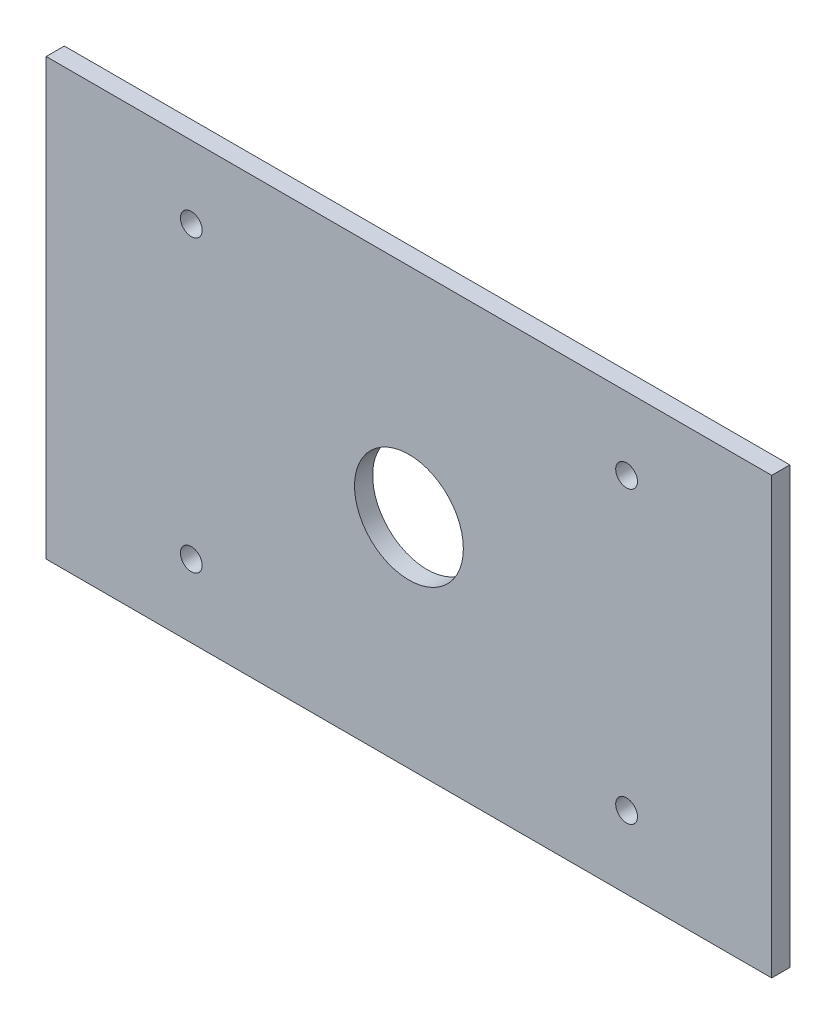
ISO-10303-21;
HEADER;
FILE_DESCRIPTION(('STEP AP214'),'2;1');
FILE_NAME('part.step','',(''),(''),'','','');
FILE_SCHEMA(('AUTOMOTIVE_DESIGN { 1 0 10303 214 1 1 1 1 }'));
ENDSEC;
DATA;
#1=APPLICATION_CONTEXT('core data for automotive mechanical design processes');
#2=APPLICATION_PROTOCOL_DEFINITION('international standard','automotive_design',2000,#1);
#3=PRODUCT_CONTEXT('',#1,'mechanical');
#4=PRODUCT('Part','Part','',(#3));
#5=PRODUCT_RELATED_PRODUCT_CATEGORY('part','',(#4));
#6=PRODUCT_DEFINITION_FORMATION('','',#4);
#7=PRODUCT_DEFINITION_CONTEXT('part definition',#1,'design');
#8=PRODUCT_DEFINITION('design','',#6,#7);
#9=PRODUCT_DEFINITION_SHAPE('','',#8);
#10=(LENGTH_UNIT() NAMED_UNIT(*) SI_UNIT(.MILLI.,.METRE.));
#11=(NAMED_UNIT(*) PLANE_ANGLE_UNIT() SI_UNIT($,.RADIAN.));
#12=(NAMED_UNIT(*) SI_UNIT($,.STERADIAN.) SOLID_ANGLE_UNIT());
#13=UNCERTAINTY_MEASURE_WITH_UNIT(LENGTH_MEASURE(1.E-05),#10,'distance_accuracy_value','');
#14=(GEOMETRIC_REPRESENTATION_CONTEXT(3) GLOBAL_UNCERTAINTY_ASSIGNED_CONTEXT((#13)) GLOBAL_UNIT_ASSIGNED_CONTEXT((#10,
#11,#12)) REPRESENTATION_CONTEXT('',''));
#15=CARTESIAN_POINT('',(0.,0.,0.));
#16=DIRECTION('',(0.,0.,1.));
#17=DIRECTION('',(1.,0.,0.));
#18=AXIS2_PLACEMENT_3D('',#15,#16,#17);
#19=CARTESIAN_POINT('',(-63.5,-38.1,3.175));
#20=DIRECTION('',(1.,0.,0.));
#21=DIRECTION('',(0.,0.,-1.));
#22=AXIS2_PLACEMENT_3D('',#19,#20,#21);
#23=PLANE('',#22);
#24=DIRECTION('',(0.,-1.,0.));
#25=VECTOR('',#24,1.);
#26=CARTESIAN_POINT('',(-63.5,-38.1,0.));
#27=LINE('',#26,#25);
#28=CARTESIAN_POINT('',(-63.5,38.1,0.));
#29=VERTEX_POINT('',#28);
#30=CARTESIAN_POINT('',(-63.5,-38.1,0.));
#31=VERTEX_POINT('',#30);
#32=EDGE_CURVE('E121',#29,#31,#27,.T.);
#33=ORIENTED_EDGE('',*,*,#32,.T.);
#34=DIRECTION('',(0.,0.,-1.));
#35=VECTOR('',#34,1.);
#36=CARTESIAN_POINT('',(-63.5,-38.1,3.175));
#37=LINE('',#36,#35);
#38=CARTESIAN_POINT('',(-63.5,-38.1,3.175));
#39=VERTEX_POINT('',#38);
#40=EDGE_CURVE('E12',#39,#31,#37,.T.);
#41=ORIENTED_EDGE('',*,*,#40,.F.);
#42=DIRECTION('',(0.,-1.,0.));
#43=VECTOR('',#42,1.);
#44=CARTESIAN_POINT('',(-63.5,-38.1,3.175));
#45=LINE('',#44,#43);
#46=CARTESIAN_POINT('',(-63.5,38.1,3.175));
#47=VERTEX_POINT('',#46);
#48=EDGE_CURVE('E104',#47,#39,#45,.T.);
#49=ORIENTED_EDGE('',*,*,#48,.F.);
#50=DIRECTION('',(0.,0.,-1.));
#51=VECTOR('',#50,1.);
#52=CARTESIAN_POINT('',(-63.5,38.1,3.175));
#53=LINE('',#52,#51);
#54=EDGE_CURVE('E117',#47,#29,#53,.T.);
#55=ORIENTED_EDGE('',*,*,#54,.T.);
#56=EDGE_LOOP('',(#33,#41,#49,#55));
#57=FACE_BOUND('',#56,.T.);
#58=ADVANCED_FACE('F50',(#57),#23,.F.);
#59=CARTESIAN_POINT('',(63.5,-38.1,3.175));
#60=DIRECTION('',(0.,1.,0.));
#61=DIRECTION('',(-1.,0.,0.));
#62=AXIS2_PLACEMENT_3D('',#59,#60,#61);
#63=PLANE('',#62);
#64=DIRECTION('',(1.,0.,0.));
#65=VECTOR('',#64,1.);
#66=CARTESIAN_POINT('',(63.5,-38.1,0.));
#67=LINE('',#66,#65);
#68=CARTESIAN_POINT('',(63.5,-38.1,0.));
#69=VERTEX_POINT('',#68);
#70=EDGE_CURVE('E109',#31,#69,#67,.T.);
#71=ORIENTED_EDGE('',*,*,#70,.T.);
#72=DIRECTION('',(0.,0.,-1.));
#73=VECTOR('',#72,1.);
#74=CARTESIAN_POINT('',(63.5,-38.1,3.175));
#75=LINE('',#74,#73);
#76=CARTESIAN_POINT('',(63.5,-38.1,3.175));
#77=VERTEX_POINT('',#76);
#78=EDGE_CURVE('E60',#77,#69,#75,.T.);
#79=ORIENTED_EDGE('',*,*,#78,.F.);
#80=DIRECTION('',(1.,0.,0.));
#81=VECTOR('',#80,1.);
#82=CARTESIAN_POINT('',(63.5,-38.1,3.175));
#83=LINE('',#82,#81);
#84=EDGE_CURVE('E99',#39,#77,#83,.T.);
#85=ORIENTED_EDGE('',*,*,#84,.F.);
#86=ORIENTED_EDGE('',*,*,#40,.T.);
#87=EDGE_LOOP('',(#71,#79,#85,#86));
#88=FACE_BOUND('',#87,.T.);
#89=ADVANCED_FACE('F108',(#88),#63,.F.);
#90=CARTESIAN_POINT('',(63.5,-38.1,3.175));
#91=DIRECTION('',(-1.,0.,0.));
#92=DIRECTION('',(0.,0.,1.));
#93=AXIS2_PLACEMENT_3D('',#90,#91,#92);
#94=PLANE('',#93);
#95=DIRECTION('',(0.,1.,0.));
#96=VECTOR('',#95,1.);
#97=CARTESIAN_POINT('',(63.5,-38.1,0.));
#98=LINE('',#97,#96);
#99=CARTESIAN_POINT('',(63.5,38.1,0.));
#100=VERTEX_POINT('',#99);
#101=EDGE_CURVE('E86',#69,#100,#98,.T.);
#102=ORIENTED_EDGE('',*,*,#101,.T.);
#103=DIRECTION('',(0.,0.,-1.));
#104=VECTOR('',#103,1.);
#105=CARTESIAN_POINT('',(63.5,38.1,3.175));
#106=LINE('',#105,#104);
#107=CARTESIAN_POINT('',(63.5,38.1,3.175));
#108=VERTEX_POINT('',#107);
#109=EDGE_CURVE('E111',#108,#100,#106,.T.);
#110=ORIENTED_EDGE('',*,*,#109,.F.);
#111=DIRECTION('',(0.,1.,0.));
#112=VECTOR('',#111,1.);
#113=CARTESIAN_POINT('',(63.5,-38.1,3.175));
#114=LINE('',#113,#112);
#115=EDGE_CURVE('E102',#77,#108,#114,.T.);
#116=ORIENTED_EDGE('',*,*,#115,.F.);
#117=ORIENTED_EDGE('',*,*,#78,.T.);
#118=EDGE_LOOP('',(#102,#110,#116,#117));
#119=FACE_BOUND('',#118,.T.);
#120=ADVANCED_FACE('F113',(#119),#94,.F.);
#121=CARTESIAN_POINT('',(63.5,38.1,3.175));
#122=DIRECTION('',(0.,-1.,0.));
#123=DIRECTION('',(1.,0.,0.));
#124=AXIS2_PLACEMENT_3D('',#121,#122,#123);
#125=PLANE('',#124);
#126=DIRECTION('',(-1.,0.,0.));
#127=VECTOR('',#126,1.);
#128=CARTESIAN_POINT('',(63.5,38.1,0.));
#129=LINE('',#128,#127);
#130=EDGE_CURVE('E92',#100,#29,#129,.T.);
#131=ORIENTED_EDGE('',*,*,#130,.T.);
#132=ORIENTED_EDGE('',*,*,#54,.F.);
#133=DIRECTION('',(-1.,0.,0.));
#134=VECTOR('',#133,1.);
#135=CARTESIAN_POINT('',(63.5,38.1,3.175));
#136=LINE('',#135,#134);
#137=EDGE_CURVE('E69',#108,#47,#136,.T.);
#138=ORIENTED_EDGE('',*,*,#137,.F.);
#139=ORIENTED_EDGE('',*,*,#109,.T.);
#140=EDGE_LOOP('',(#131,#132,#138,#139));
#141=FACE_BOUND('',#140,.T.);
#142=ADVANCED_FACE('F186',(#141),#125,.F.);
#143=CARTESIAN_POINT('',(0.,0.,3.175));
#144=DIRECTION('',(0.,0.,1.));
#145=DIRECTION('',(1.,0.,0.));
#146=AXIS2_PLACEMENT_3D('',#143,#144,#145);
#147=PLANE('',#146);
#148=CARTESIAN_POINT('',(38.1,25.4,3.175));
#149=DIRECTION('',(0.,0.,1.));
#150=DIRECTION('',(1.,0.,0.));
#151=AXIS2_PLACEMENT_3D('',#148,#149,#150);
#152=CIRCLE('',#151,1.90500000000001);
#153=CARTESIAN_POINT('',(40.005,25.4,3.175));
#154=VERTEX_POINT('',#153);
#155=EDGE_CURVE('E262',#154,#154,#152,.T.);
#156=ORIENTED_EDGE('',*,*,#155,.F.);
#157=EDGE_LOOP('',(#156));
#158=FACE_BOUND('',#157,.T.);
#159=CARTESIAN_POINT('',(38.1,-25.4,3.175));
#160=DIRECTION('',(0.,0.,1.));
#161=DIRECTION('',(1.,0.,0.));
#162=AXIS2_PLACEMENT_3D('',#159,#160,#161);
#163=CIRCLE('',#162,1.90500000000001);
#164=CARTESIAN_POINT('',(40.005,-25.4,3.175));
#165=VERTEX_POINT('',#164);
#166=EDGE_CURVE('E267',#165,#165,#163,.T.);
#167=ORIENTED_EDGE('',*,*,#166,.F.);
#168=EDGE_LOOP('',(#167));
#169=FACE_BOUND('',#168,.T.);
#170=CARTESIAN_POINT('',(-38.1,-25.4,3.175));
#171=DIRECTION('',(0.,0.,1.));
#172=DIRECTION('',(1.,0.,0.));
#173=AXIS2_PLACEMENT_3D('',#170,#171,#172);
#174=CIRCLE('',#173,1.90500000000001);
#175=CARTESIAN_POINT('',(-36.195,-25.4,3.175));
#176=VERTEX_POINT('',#175);
#177=EDGE_CURVE('E247',#176,#176,#174,.T.);
#178=ORIENTED_EDGE('',*,*,#177,.F.);
#179=EDGE_LOOP('',(#178));
#180=FACE_BOUND('',#179,.T.);
#181=CARTESIAN_POINT('',(-38.1,25.4,3.175));
#182=DIRECTION('',(0.,0.,1.));
#183=DIRECTION('',(1.,0.,0.));
#184=AXIS2_PLACEMENT_3D('',#181,#182,#183);
#185=CIRCLE('',#184,1.90500000000001);
#186=CARTESIAN_POINT('',(-36.195,25.4,3.175));
#187=VERTEX_POINT('',#186);
#188=EDGE_CURVE('E140',#187,#187,#185,.T.);
#189=ORIENTED_EDGE('',*,*,#188,.F.);
#190=EDGE_LOOP('',(#189));
#191=FACE_BOUND('',#190,.T.);
#192=CARTESIAN_POINT('',(0.,0.,3.175));
#193=DIRECTION('',(0.,0.,1.));
#194=DIRECTION('',(1.,0.,0.));
#195=AXIS2_PLACEMENT_3D('',#192,#193,#194);
#196=CIRCLE('',#195,9.525);
#197=CARTESIAN_POINT('',(9.525,0.,3.175));
#198=VERTEX_POINT('',#197);
#199=EDGE_CURVE('E258',#198,#198,#196,.T.);
#200=ORIENTED_EDGE('',*,*,#199,.F.);
#201=EDGE_LOOP('',(#200));
#202=FACE_BOUND('',#201,.T.);
#203=ORIENTED_EDGE('',*,*,#48,.T.);
#204=ORIENTED_EDGE('',*,*,#84,.T.);
#205=ORIENTED_EDGE('',*,*,#115,.T.);
#206=ORIENTED_EDGE('',*,*,#137,.T.);
#207=EDGE_LOOP('',(#203,#204,#205,#206));
#208=FACE_BOUND('',#207,.T.);
#209=ADVANCED_FACE('F100',(#158,#169,#180,#191,#202,#208),#147,.T.);
#210=CARTESIAN_POINT('',(0.,0.,0.));
#211=DIRECTION('',(0.,0.,1.));
#212=DIRECTION('',(1.,0.,0.));
#213=AXIS2_PLACEMENT_3D('',#210,#211,#212);
#214=PLANE('',#213);
#215=CARTESIAN_POINT('',(38.1,25.4,0.));
#216=DIRECTION('',(0.,0.,1.));
#217=DIRECTION('',(1.,0.,0.));
#218=AXIS2_PLACEMENT_3D('',#215,#216,#217);
#219=CIRCLE('',#218,1.90500000000001);
#220=CARTESIAN_POINT('',(40.005,25.4,0.));
#221=VERTEX_POINT('',#220);
#222=EDGE_CURVE('E53',#221,#221,#219,.T.);
#223=ORIENTED_EDGE('',*,*,#222,.T.);
#224=EDGE_LOOP('',(#223));
#225=FACE_BOUND('',#224,.T.);
#226=CARTESIAN_POINT('',(38.1,-25.4,0.));
#227=DIRECTION('',(0.,0.,1.));
#228=DIRECTION('',(1.,0.,0.));
#229=AXIS2_PLACEMENT_3D('',#226,#227,#228);
#230=CIRCLE('',#229,1.90500000000001);
#231=CARTESIAN_POINT('',(40.005,-25.4,0.));
#232=VERTEX_POINT('',#231);
#233=EDGE_CURVE('E143',#232,#232,#230,.T.);
#234=ORIENTED_EDGE('',*,*,#233,.T.);
#235=EDGE_LOOP('',(#234));
#236=FACE_BOUND('',#235,.T.);
#237=CARTESIAN_POINT('',(-38.1,-25.4,0.));
#238=DIRECTION('',(0.,0.,1.));
#239=DIRECTION('',(1.,0.,0.));
#240=AXIS2_PLACEMENT_3D('',#237,#238,#239);
#241=CIRCLE('',#240,1.90500000000001);
#242=CARTESIAN_POINT('',(-36.195,-25.4,0.));
#243=VERTEX_POINT('',#242);
#244=EDGE_CURVE('E139',#243,#243,#241,.T.);
#245=ORIENTED_EDGE('',*,*,#244,.T.);
#246=EDGE_LOOP('',(#245));
#247=FACE_BOUND('',#246,.T.);
#248=CARTESIAN_POINT('',(-38.1,25.4,0.));
#249=DIRECTION('',(0.,0.,1.));
#250=DIRECTION('',(1.,0.,0.));
#251=AXIS2_PLACEMENT_3D('',#248,#249,#250);
#252=CIRCLE('',#251,1.90500000000001);
#253=CARTESIAN_POINT('',(-36.195,25.4,0.));
#254=VERTEX_POINT('',#253);
#255=EDGE_CURVE('E135',#254,#254,#252,.T.);
#256=ORIENTED_EDGE('',*,*,#255,.T.);
#257=EDGE_LOOP('',(#256));
#258=FACE_BOUND('',#257,.T.);
#259=CARTESIAN_POINT('',(0.,0.,0.));
#260=DIRECTION('',(0.,0.,1.));
#261=DIRECTION('',(1.,0.,0.));
#262=AXIS2_PLACEMENT_3D('',#259,#260,#261);
#263=CIRCLE('',#262,9.525);
#264=CARTESIAN_POINT('',(9.525,0.,0.));
#265=VERTEX_POINT('',#264);
#266=EDGE_CURVE('E255',#265,#265,#263,.T.);
#267=ORIENTED_EDGE('',*,*,#266,.T.);
#268=EDGE_LOOP('',(#267));
#269=FACE_BOUND('',#268,.T.);
#270=ORIENTED_EDGE('',*,*,#32,.F.);
#271=ORIENTED_EDGE('',*,*,#130,.F.);
#272=ORIENTED_EDGE('',*,*,#101,.F.);
#273=ORIENTED_EDGE('',*,*,#70,.F.);
#274=EDGE_LOOP('',(#270,#271,#272,#273));
#275=FACE_BOUND('',#274,.T.);
#276=ADVANCED_FACE('F152',(#225,#236,#247,#258,#269,#275),#214,.F.);
#277=CARTESIAN_POINT('',(-38.1,25.4,-22.225));
#278=DIRECTION('',(0.,0.,1.));
#279=DIRECTION('',(1.,0.,0.));
#280=AXIS2_PLACEMENT_3D('',#277,#278,#279);
#281=CYLINDRICAL_SURFACE('',#280,1.90500000000001);
#282=ORIENTED_EDGE('',*,*,#188,.T.);
#283=EDGE_LOOP('',(#282));
#284=FACE_BOUND('',#283,.T.);
#285=ORIENTED_EDGE('',*,*,#255,.F.);
#286=EDGE_LOOP('',(#285));
#287=FACE_BOUND('',#286,.T.);
#288=ADVANCED_FACE('F179',(#284,#287),#281,.F.);
#289=CARTESIAN_POINT('',(-38.1,-25.4,-22.225));
#290=DIRECTION('',(0.,0.,1.));
#291=DIRECTION('',(1.,0.,0.));
#292=AXIS2_PLACEMENT_3D('',#289,#290,#291);
#293=CYLINDRICAL_SURFACE('',#292,1.90500000000001);
#294=ORIENTED_EDGE('',*,*,#177,.T.);
#295=EDGE_LOOP('',(#294));
#296=FACE_BOUND('',#295,.T.);
#297=ORIENTED_EDGE('',*,*,#244,.F.);
#298=EDGE_LOOP('',(#297));
#299=FACE_BOUND('',#298,.T.);
#300=ADVANCED_FACE('F166',(#296,#299),#293,.F.);
#301=CARTESIAN_POINT('',(38.1,-25.4,-22.225));
#302=DIRECTION('',(0.,0.,1.));
#303=DIRECTION('',(1.,0.,0.));
#304=AXIS2_PLACEMENT_3D('',#301,#302,#303);
#305=CYLINDRICAL_SURFACE('',#304,1.90500000000001);
#306=ORIENTED_EDGE('',*,*,#166,.T.);
#307=EDGE_LOOP('',(#306));
#308=FACE_BOUND('',#307,.T.);
#309=ORIENTED_EDGE('',*,*,#233,.F.);
#310=EDGE_LOOP('',(#309));
#311=FACE_BOUND('',#310,.T.);
#312=ADVANCED_FACE('F157',(#308,#311),#305,.F.);
#313=CARTESIAN_POINT('',(38.1,25.4,-22.225));
#314=DIRECTION('',(0.,0.,1.));
#315=DIRECTION('',(1.,0.,0.));
#316=AXIS2_PLACEMENT_3D('',#313,#314,#315);
#317=CYLINDRICAL_SURFACE('',#316,1.90500000000001);
#318=ORIENTED_EDGE('',*,*,#155,.T.);
#319=EDGE_LOOP('',(#318));
#320=FACE_BOUND('',#319,.T.);
#321=ORIENTED_EDGE('',*,*,#222,.F.);
#322=EDGE_LOOP('',(#321));
#323=FACE_BOUND('',#322,.T.);
#324=ADVANCED_FACE('F154',(#320,#323),#317,.F.);
#325=CARTESIAN_POINT('',(0.,0.,-22.225));
#326=DIRECTION('',(0.,0.,1.));
#327=DIRECTION('',(1.,0.,0.));
#328=AXIS2_PLACEMENT_3D('',#325,#326,#327);
#329=CYLINDRICAL_SURFACE('',#328,9.525);
#330=ORIENTED_EDGE('',*,*,#199,.T.);
#331=EDGE_LOOP('',(#330));
#332=FACE_BOUND('',#331,.T.);
#333=ORIENTED_EDGE('',*,*,#266,.F.);
#334=EDGE_LOOP('',(#333));
#335=FACE_BOUND('',#334,.T.);
#336=ADVANCED_FACE('F156',(#332,#335),#329,.F.);
#337=CLOSED_SHELL('',(#58,#89,#120,#142,#209,#276,#288,#300,#312,#324,#336));
#338=MANIFOLD_SOLID_BREP('B2',#337);
#339=ADVANCED_BREP_SHAPE_REPRESENTATION('',(#18,#338),#14);
#340=SHAPE_DEFINITION_REPRESENTATION(#9,#339);
ENDSEC;
END-ISO-10303-21;
